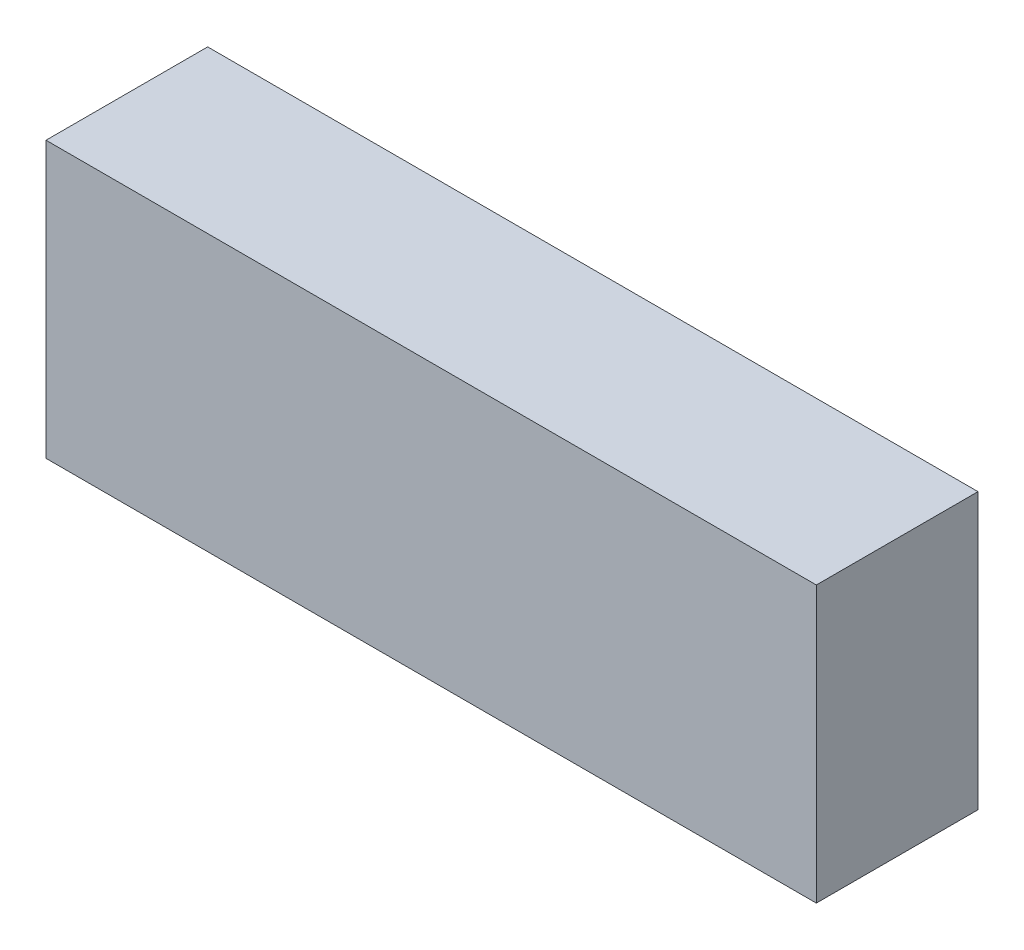
ISO-10303-21;
HEADER;
FILE_DESCRIPTION(('STEP AP214'),'2;1');
FILE_NAME('part.step','',(''),(''),'','','');
FILE_SCHEMA(('AUTOMOTIVE_DESIGN { 1 0 10303 214 1 1 1 1 }'));
ENDSEC;
DATA;
#1=APPLICATION_CONTEXT('core data for automotive mechanical design processes');
#2=APPLICATION_PROTOCOL_DEFINITION('international standard','automotive_design',2000,#1);
#3=PRODUCT_CONTEXT('',#1,'mechanical');
#4=PRODUCT('Part','Part','',(#3));
#5=PRODUCT_RELATED_PRODUCT_CATEGORY('part','',(#4));
#6=PRODUCT_DEFINITION_FORMATION('','',#4);
#7=PRODUCT_DEFINITION_CONTEXT('part definition',#1,'design');
#8=PRODUCT_DEFINITION('design','',#6,#7);
#9=PRODUCT_DEFINITION_SHAPE('','',#8);
#10=(LENGTH_UNIT() NAMED_UNIT(*) SI_UNIT(.MILLI.,.METRE.));
#11=(NAMED_UNIT(*) PLANE_ANGLE_UNIT() SI_UNIT($,.RADIAN.));
#12=(NAMED_UNIT(*) SI_UNIT($,.STERADIAN.) SOLID_ANGLE_UNIT());
#13=UNCERTAINTY_MEASURE_WITH_UNIT(LENGTH_MEASURE(1.E-05),#10,'distance_accuracy_value','');
#14=(GEOMETRIC_REPRESENTATION_CONTEXT(3) GLOBAL_UNCERTAINTY_ASSIGNED_CONTEXT((#13)) GLOBAL_UNIT_ASSIGNED_CONTEXT((#10,
#11,#12)) REPRESENTATION_CONTEXT('',''));
#15=CARTESIAN_POINT('',(0.,0.,0.));
#16=DIRECTION('',(0.,0.,1.));
#17=DIRECTION('',(1.,0.,0.));
#18=AXIS2_PLACEMENT_3D('',#15,#16,#17);
#19=CARTESIAN_POINT('',(43.7,-111.,258.875));
#20=DIRECTION('',(0.,0.,1.));
#21=DIRECTION('',(1.,0.,0.));
#22=AXIS2_PLACEMENT_3D('',#19,#20,#21);
#23=PLANE('',#22);
#24=DIRECTION('',(-1.,0.,0.));
#25=VECTOR('',#24,1.);
#26=CARTESIAN_POINT('',(43.7,-111.,258.875));
#27=LINE('',#26,#25);
#28=CARTESIAN_POINT('',(43.7,-111.,258.875));
#29=VERTEX_POINT('',#28);
#30=CARTESIAN_POINT('',(16.3,-111.,258.875));
#31=VERTEX_POINT('',#30);
#32=EDGE_CURVE('E103',#29,#31,#27,.T.);
#33=ORIENTED_EDGE('',*,*,#32,.F.);
#34=DIRECTION('',(0.,1.,0.));
#35=VECTOR('',#34,1.);
#36=CARTESIAN_POINT('',(43.7,-111.,258.875));
#37=LINE('',#36,#35);
#38=CARTESIAN_POINT('',(43.7,-101.2,258.875));
#39=VERTEX_POINT('',#38);
#40=EDGE_CURVE('E72',#29,#39,#37,.T.);
#41=ORIENTED_EDGE('',*,*,#40,.T.);
#42=DIRECTION('',(-1.,0.,0.));
#43=VECTOR('',#42,1.);
#44=CARTESIAN_POINT('',(43.7,-101.2,258.875));
#45=LINE('',#44,#43);
#46=CARTESIAN_POINT('',(16.3,-101.2,258.875));
#47=VERTEX_POINT('',#46);
#48=EDGE_CURVE('E85',#39,#47,#45,.T.);
#49=ORIENTED_EDGE('',*,*,#48,.T.);
#50=DIRECTION('',(0.,1.,0.));
#51=VECTOR('',#50,1.);
#52=CARTESIAN_POINT('',(16.3,-111.,258.875));
#53=LINE('',#52,#51);
#54=EDGE_CURVE('E10',#31,#47,#53,.T.);
#55=ORIENTED_EDGE('',*,*,#54,.F.);
#56=EDGE_LOOP('',(#33,#41,#49,#55));
#57=FACE_BOUND('',#56,.T.);
#58=ADVANCED_FACE('F15',(#57),#23,.T.);
#59=CARTESIAN_POINT('',(43.7,-111.,253.125));
#60=DIRECTION('',(0.,0.,1.));
#61=DIRECTION('',(1.,0.,0.));
#62=AXIS2_PLACEMENT_3D('',#59,#60,#61);
#63=PLANE('',#62);
#64=DIRECTION('',(0.,1.,0.));
#65=VECTOR('',#64,1.);
#66=CARTESIAN_POINT('',(16.3,-111.,253.125));
#67=LINE('',#66,#65);
#68=CARTESIAN_POINT('',(16.3,-111.,253.125));
#69=VERTEX_POINT('',#68);
#70=CARTESIAN_POINT('',(16.3,-101.2,253.125));
#71=VERTEX_POINT('',#70);
#72=EDGE_CURVE('E25',#69,#71,#67,.T.);
#73=ORIENTED_EDGE('',*,*,#72,.T.);
#74=DIRECTION('',(-1.,0.,0.));
#75=VECTOR('',#74,1.);
#76=CARTESIAN_POINT('',(43.7,-101.2,253.125));
#77=LINE('',#76,#75);
#78=CARTESIAN_POINT('',(43.7,-101.2,253.125));
#79=VERTEX_POINT('',#78);
#80=EDGE_CURVE('E75',#79,#71,#77,.T.);
#81=ORIENTED_EDGE('',*,*,#80,.F.);
#82=DIRECTION('',(0.,1.,0.));
#83=VECTOR('',#82,1.);
#84=CARTESIAN_POINT('',(43.7,-111.,253.125));
#85=LINE('',#84,#83);
#86=CARTESIAN_POINT('',(43.7,-111.,253.125));
#87=VERTEX_POINT('',#86);
#88=EDGE_CURVE('E61',#87,#79,#85,.T.);
#89=ORIENTED_EDGE('',*,*,#88,.F.);
#90=DIRECTION('',(-1.,0.,0.));
#91=VECTOR('',#90,1.);
#92=CARTESIAN_POINT('',(43.7,-111.,253.125));
#93=LINE('',#92,#91);
#94=EDGE_CURVE('E91',#87,#69,#93,.T.);
#95=ORIENTED_EDGE('',*,*,#94,.T.);
#96=EDGE_LOOP('',(#73,#81,#89,#95));
#97=FACE_BOUND('',#96,.T.);
#98=ADVANCED_FACE('F76',(#97),#63,.F.);
#99=CARTESIAN_POINT('',(16.3,-111.,253.125));
#100=DIRECTION('',(-1.,0.,0.));
#101=DIRECTION('',(0.,0.,1.));
#102=AXIS2_PLACEMENT_3D('',#99,#100,#101);
#103=PLANE('',#102);
#104=ORIENTED_EDGE('',*,*,#72,.F.);
#105=DIRECTION('',(0.,0.,1.));
#106=VECTOR('',#105,1.);
#107=CARTESIAN_POINT('',(16.3,-111.,253.125));
#108=LINE('',#107,#106);
#109=EDGE_CURVE('E98',#69,#31,#108,.T.);
#110=ORIENTED_EDGE('',*,*,#109,.T.);
#111=ORIENTED_EDGE('',*,*,#54,.T.);
#112=DIRECTION('',(0.,0.,1.));
#113=VECTOR('',#112,1.);
#114=CARTESIAN_POINT('',(16.3,-101.2,253.125));
#115=LINE('',#114,#113);
#116=EDGE_CURVE('E81',#71,#47,#115,.T.);
#117=ORIENTED_EDGE('',*,*,#116,.F.);
#118=EDGE_LOOP('',(#104,#110,#111,#117));
#119=FACE_BOUND('',#118,.T.);
#120=ADVANCED_FACE('F122',(#119),#103,.T.);
#121=CARTESIAN_POINT('',(43.7,-111.,253.125));
#122=DIRECTION('',(-1.,0.,0.));
#123=DIRECTION('',(0.,0.,1.));
#124=AXIS2_PLACEMENT_3D('',#121,#122,#123);
#125=PLANE('',#124);
#126=DIRECTION('',(0.,0.,1.));
#127=VECTOR('',#126,1.);
#128=CARTESIAN_POINT('',(43.7,-101.2,253.125));
#129=LINE('',#128,#127);
#130=EDGE_CURVE('E18',#79,#39,#129,.T.);
#131=ORIENTED_EDGE('',*,*,#130,.T.);
#132=ORIENTED_EDGE('',*,*,#40,.F.);
#133=DIRECTION('',(0.,0.,1.));
#134=VECTOR('',#133,1.);
#135=CARTESIAN_POINT('',(43.7,-111.,253.125));
#136=LINE('',#135,#134);
#137=EDGE_CURVE('E67',#87,#29,#136,.T.);
#138=ORIENTED_EDGE('',*,*,#137,.F.);
#139=ORIENTED_EDGE('',*,*,#88,.T.);
#140=EDGE_LOOP('',(#131,#132,#138,#139));
#141=FACE_BOUND('',#140,.T.);
#142=ADVANCED_FACE('F63',(#141),#125,.F.);
#143=CARTESIAN_POINT('',(43.7,-101.2,253.125));
#144=DIRECTION('',(0.,1.,0.));
#145=DIRECTION('',(1.,0.,0.));
#146=AXIS2_PLACEMENT_3D('',#143,#144,#145);
#147=PLANE('',#146);
#148=ORIENTED_EDGE('',*,*,#130,.F.);
#149=ORIENTED_EDGE('',*,*,#80,.T.);
#150=ORIENTED_EDGE('',*,*,#116,.T.);
#151=ORIENTED_EDGE('',*,*,#48,.F.);
#152=EDGE_LOOP('',(#148,#149,#150,#151));
#153=FACE_BOUND('',#152,.T.);
#154=ADVANCED_FACE('F84',(#153),#147,.T.);
#155=CARTESIAN_POINT('',(43.7,-111.,253.125));
#156=DIRECTION('',(0.,1.,0.));
#157=DIRECTION('',(1.,0.,0.));
#158=AXIS2_PLACEMENT_3D('',#155,#156,#157);
#159=PLANE('',#158);
#160=ORIENTED_EDGE('',*,*,#32,.T.);
#161=ORIENTED_EDGE('',*,*,#109,.F.);
#162=ORIENTED_EDGE('',*,*,#94,.F.);
#163=ORIENTED_EDGE('',*,*,#137,.T.);
#164=EDGE_LOOP('',(#160,#161,#162,#163));
#165=FACE_BOUND('',#164,.T.);
#166=ADVANCED_FACE('F123',(#165),#159,.F.);
#167=CLOSED_SHELL('',(#58,#98,#120,#142,#154,#166));
#168=MANIFOLD_SOLID_BREP('B1',#167);
#169=ADVANCED_BREP_SHAPE_REPRESENTATION('',(#18,#168),#14);
#170=SHAPE_DEFINITION_REPRESENTATION(#9,#169);
ENDSEC;
END-ISO-10303-21;
